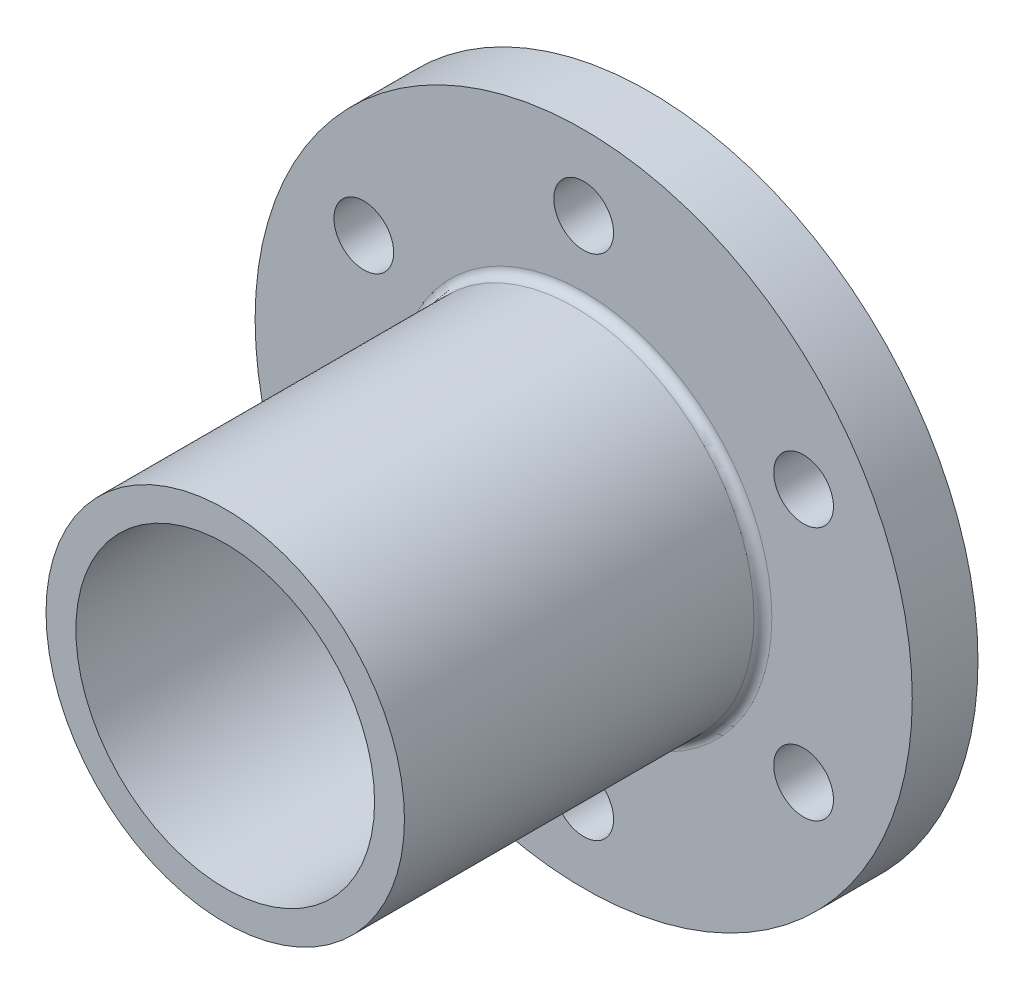
ISO-10303-21;
HEADER;
FILE_DESCRIPTION(('STEP AP214'),'2;1');
FILE_NAME('part.step','',(''),(''),'','','');
FILE_SCHEMA(('AUTOMOTIVE_DESIGN { 1 0 10303 214 1 1 1 1 }'));
ENDSEC;
DATA;
#1=APPLICATION_CONTEXT('core data for automotive mechanical design processes');
#2=APPLICATION_PROTOCOL_DEFINITION('international standard','automotive_design',2000,#1);
#3=PRODUCT_CONTEXT('',#1,'mechanical');
#4=PRODUCT('Part','Part','',(#3));
#5=PRODUCT_RELATED_PRODUCT_CATEGORY('part','',(#4));
#6=PRODUCT_DEFINITION_FORMATION('','',#4);
#7=PRODUCT_DEFINITION_CONTEXT('part definition',#1,'design');
#8=PRODUCT_DEFINITION('design','',#6,#7);
#9=PRODUCT_DEFINITION_SHAPE('','',#8);
#10=(LENGTH_UNIT() NAMED_UNIT(*) SI_UNIT(.MILLI.,.METRE.));
#11=(NAMED_UNIT(*) PLANE_ANGLE_UNIT() SI_UNIT($,.RADIAN.));
#12=(NAMED_UNIT(*) SI_UNIT($,.STERADIAN.) SOLID_ANGLE_UNIT());
#13=UNCERTAINTY_MEASURE_WITH_UNIT(LENGTH_MEASURE(1.E-05),#10,'distance_accuracy_value','');
#14=(GEOMETRIC_REPRESENTATION_CONTEXT(3) GLOBAL_UNCERTAINTY_ASSIGNED_CONTEXT((#13)) GLOBAL_UNIT_ASSIGNED_CONTEXT((#10,
#11,#12)) REPRESENTATION_CONTEXT('',''));
#15=CARTESIAN_POINT('',(0.,0.,0.));
#16=DIRECTION('',(0.,0.,1.));
#17=DIRECTION('',(1.,0.,0.));
#18=AXIS2_PLACEMENT_3D('',#15,#16,#17);
#19=CARTESIAN_POINT('',(0.,0.,22.));
#20=DIRECTION('',(0.,0.,-1.));
#21=DIRECTION('',(-1.,0.,0.));
#22=AXIS2_PLACEMENT_3D('',#19,#20,#21);
#23=CYLINDRICAL_SURFACE('',#22,110.);
#24=CARTESIAN_POINT('',(0.,0.,22.));
#25=DIRECTION('',(0.,0.,1.));
#26=DIRECTION('',(1.,0.,0.));
#27=AXIS2_PLACEMENT_3D('',#24,#25,#26);
#28=CIRCLE('',#27,110.);
#29=CARTESIAN_POINT('',(110.,0.,22.));
#30=VERTEX_POINT('',#29);
#31=EDGE_CURVE('E50',#30,#30,#28,.T.);
#32=ORIENTED_EDGE('',*,*,#31,.F.);
#33=EDGE_LOOP('',(#32));
#34=FACE_BOUND('',#33,.T.);
#35=CARTESIAN_POINT('',(0.,0.,0.));
#36=DIRECTION('',(0.,0.,1.));
#37=DIRECTION('',(1.,0.,0.));
#38=AXIS2_PLACEMENT_3D('',#35,#36,#37);
#39=CIRCLE('',#38,110.);
#40=CARTESIAN_POINT('',(110.,0.,0.));
#41=VERTEX_POINT('',#40);
#42=EDGE_CURVE('E55',#41,#41,#39,.T.);
#43=ORIENTED_EDGE('',*,*,#42,.T.);
#44=EDGE_LOOP('',(#43));
#45=FACE_BOUND('',#44,.T.);
#46=ADVANCED_FACE('F37',(#34,#45),#23,.T.);
#47=CARTESIAN_POINT('',(0.,0.,22.));
#48=DIRECTION('',(0.,0.,1.));
#49=DIRECTION('',(1.,0.,0.));
#50=AXIS2_PLACEMENT_3D('',#47,#48,#49);
#51=PLANE('',#50);
#52=CARTESIAN_POINT('',(0.,0.,22.));
#53=DIRECTION('',(0.,0.,1.));
#54=DIRECTION('',(1.,0.,0.));
#55=AXIS2_PLACEMENT_3D('',#52,#53,#54);
#56=CIRCLE('',#55,63.);
#57=CARTESIAN_POINT('',(63.,0.,22.));
#58=VERTEX_POINT('',#57);
#59=EDGE_CURVE('E10',#58,#58,#56,.F.);
#60=ORIENTED_EDGE('',*,*,#59,.T.);
#61=EDGE_LOOP('',(#60));
#62=FACE_BOUND('',#61,.T.);
#63=CARTESIAN_POINT('',(0.,85.,22.));
#64=DIRECTION('',(0.,0.,1.));
#65=DIRECTION('',(1.,0.,0.));
#66=AXIS2_PLACEMENT_3D('',#63,#64,#65);
#67=CIRCLE('',#66,10.);
#68=CARTESIAN_POINT('',(10.,85.,22.));
#69=VERTEX_POINT('',#68);
#70=EDGE_CURVE('E107',#69,#69,#67,.T.);
#71=ORIENTED_EDGE('',*,*,#70,.F.);
#72=EDGE_LOOP('',(#71));
#73=FACE_BOUND('',#72,.T.);
#74=CARTESIAN_POINT('',(-73.6121593216755,42.4999999999968,22.));
#75=DIRECTION('',(0.,0.,1.));
#76=DIRECTION('',(1.,0.,0.));
#77=AXIS2_PLACEMENT_3D('',#74,#75,#76);
#78=CIRCLE('',#77,10.0000000000036);
#79=CARTESIAN_POINT('',(-63.6121593216719,42.4999999999968,22.));
#80=VERTEX_POINT('',#79);
#81=EDGE_CURVE('E108',#80,#80,#78,.T.);
#82=ORIENTED_EDGE('',*,*,#81,.F.);
#83=EDGE_LOOP('',(#82));
#84=FACE_BOUND('',#83,.T.);
#85=CARTESIAN_POINT('',(-73.6121593216719,-42.5000000000032,22.));
#86=DIRECTION('',(0.,0.,1.));
#87=DIRECTION('',(1.,0.,0.));
#88=AXIS2_PLACEMENT_3D('',#85,#86,#87);
#89=CIRCLE('',#88,10.0000000000069);
#90=CARTESIAN_POINT('',(-63.612159321665,-42.5000000000032,22.));
#91=VERTEX_POINT('',#90);
#92=EDGE_CURVE('E74',#91,#91,#89,.T.);
#93=ORIENTED_EDGE('',*,*,#92,.F.);
#94=EDGE_LOOP('',(#93));
#95=FACE_BOUND('',#94,.T.);
#96=CARTESIAN_POINT('',(7.21630741137477E-12,-85.,22.));
#97=DIRECTION('',(0.,0.,1.));
#98=DIRECTION('',(1.,0.,0.));
#99=AXIS2_PLACEMENT_3D('',#96,#97,#98);
#100=CIRCLE('',#99,10.0000000000075);
#101=CARTESIAN_POINT('',(10.0000000000147,-85.,22.));
#102=VERTEX_POINT('',#101);
#103=EDGE_CURVE('E83',#102,#102,#100,.T.);
#104=ORIENTED_EDGE('',*,*,#103,.F.);
#105=EDGE_LOOP('',(#104));
#106=FACE_BOUND('',#105,.T.);
#107=CARTESIAN_POINT('',(73.6121593216827,-42.4999999999969,22.));
#108=DIRECTION('',(0.,0.,1.));
#109=DIRECTION('',(1.,0.,0.));
#110=AXIS2_PLACEMENT_3D('',#107,#108,#109);
#111=CIRCLE('',#110,10.0000000000046);
#112=CARTESIAN_POINT('',(83.6121593216873,-42.4999999999969,22.));
#113=VERTEX_POINT('',#112);
#114=EDGE_CURVE('E91',#113,#113,#111,.T.);
#115=ORIENTED_EDGE('',*,*,#114,.F.);
#116=EDGE_LOOP('',(#115));
#117=FACE_BOUND('',#116,.T.);
#118=CARTESIAN_POINT('',(73.6121593216791,42.5000000000031,22.));
#119=DIRECTION('',(0.,0.,1.));
#120=DIRECTION('',(1.,0.,0.));
#121=AXIS2_PLACEMENT_3D('',#118,#119,#120);
#122=CIRCLE('',#121,10.000000000001);
#123=CARTESIAN_POINT('',(83.6121593216801,42.5000000000031,22.));
#124=VERTEX_POINT('',#123);
#125=EDGE_CURVE('E99',#124,#124,#122,.T.);
#126=ORIENTED_EDGE('',*,*,#125,.F.);
#127=EDGE_LOOP('',(#126));
#128=FACE_BOUND('',#127,.T.);
#129=ORIENTED_EDGE('',*,*,#31,.T.);
#130=EDGE_LOOP('',(#129));
#131=FACE_BOUND('',#130,.T.);
#132=ADVANCED_FACE('F132',(#62,#73,#84,#95,#106,#117,#128,#131),#51,.T.);
#133=CARTESIAN_POINT('',(0.,0.,0.));
#134=DIRECTION('',(0.,0.,1.));
#135=DIRECTION('',(1.,0.,0.));
#136=AXIS2_PLACEMENT_3D('',#133,#134,#135);
#137=PLANE('',#136);
#138=CARTESIAN_POINT('',(0.,85.,0.));
#139=DIRECTION('',(0.,0.,1.));
#140=DIRECTION('',(1.,0.,0.));
#141=AXIS2_PLACEMENT_3D('',#138,#139,#140);
#142=CIRCLE('',#141,10.);
#143=CARTESIAN_POINT('',(10.,85.,0.));
#144=VERTEX_POINT('',#143);
#145=EDGE_CURVE('E73',#144,#144,#142,.T.);
#146=ORIENTED_EDGE('',*,*,#145,.T.);
#147=EDGE_LOOP('',(#146));
#148=FACE_BOUND('',#147,.T.);
#149=CARTESIAN_POINT('',(-73.6121593216755,42.4999999999968,0.));
#150=DIRECTION('',(0.,0.,1.));
#151=DIRECTION('',(1.,0.,0.));
#152=AXIS2_PLACEMENT_3D('',#149,#150,#151);
#153=CIRCLE('',#152,10.0000000000036);
#154=CARTESIAN_POINT('',(-63.6121593216719,42.4999999999968,0.));
#155=VERTEX_POINT('',#154);
#156=EDGE_CURVE('E79',#155,#155,#153,.T.);
#157=ORIENTED_EDGE('',*,*,#156,.T.);
#158=EDGE_LOOP('',(#157));
#159=FACE_BOUND('',#158,.T.);
#160=CARTESIAN_POINT('',(-73.6121593216719,-42.5000000000032,0.));
#161=DIRECTION('',(0.,0.,1.));
#162=DIRECTION('',(1.,0.,0.));
#163=AXIS2_PLACEMENT_3D('',#160,#161,#162);
#164=CIRCLE('',#163,10.0000000000069);
#165=CARTESIAN_POINT('',(-63.612159321665,-42.5000000000032,0.));
#166=VERTEX_POINT('',#165);
#167=EDGE_CURVE('E78',#166,#166,#164,.T.);
#168=ORIENTED_EDGE('',*,*,#167,.T.);
#169=EDGE_LOOP('',(#168));
#170=FACE_BOUND('',#169,.T.);
#171=CARTESIAN_POINT('',(7.21630741137477E-12,-85.,0.));
#172=DIRECTION('',(0.,0.,1.));
#173=DIRECTION('',(1.,0.,0.));
#174=AXIS2_PLACEMENT_3D('',#171,#172,#173);
#175=CIRCLE('',#174,10.0000000000075);
#176=CARTESIAN_POINT('',(10.0000000000147,-85.,0.));
#177=VERTEX_POINT('',#176);
#178=EDGE_CURVE('E87',#177,#177,#175,.T.);
#179=ORIENTED_EDGE('',*,*,#178,.T.);
#180=EDGE_LOOP('',(#179));
#181=FACE_BOUND('',#180,.T.);
#182=CARTESIAN_POINT('',(73.6121593216827,-42.4999999999969,0.));
#183=DIRECTION('',(0.,0.,1.));
#184=DIRECTION('',(1.,0.,0.));
#185=AXIS2_PLACEMENT_3D('',#182,#183,#184);
#186=CIRCLE('',#185,10.0000000000046);
#187=CARTESIAN_POINT('',(83.6121593216873,-42.4999999999969,0.));
#188=VERTEX_POINT('',#187);
#189=EDGE_CURVE('E95',#188,#188,#186,.T.);
#190=ORIENTED_EDGE('',*,*,#189,.T.);
#191=EDGE_LOOP('',(#190));
#192=FACE_BOUND('',#191,.T.);
#193=CARTESIAN_POINT('',(73.6121593216791,42.5000000000031,0.));
#194=DIRECTION('',(0.,0.,1.));
#195=DIRECTION('',(1.,0.,0.));
#196=AXIS2_PLACEMENT_3D('',#193,#194,#195);
#197=CIRCLE('',#196,10.000000000001);
#198=CARTESIAN_POINT('',(83.6121593216801,42.5000000000031,0.));
#199=VERTEX_POINT('',#198);
#200=EDGE_CURVE('E103',#199,#199,#197,.T.);
#201=ORIENTED_EDGE('',*,*,#200,.T.);
#202=EDGE_LOOP('',(#201));
#203=FACE_BOUND('',#202,.T.);
#204=CARTESIAN_POINT('',(0.,0.,0.));
#205=DIRECTION('',(0.,0.,1.));
#206=DIRECTION('',(1.,0.,0.));
#207=AXIS2_PLACEMENT_3D('',#204,#205,#206);
#208=CIRCLE('',#207,50.);
#209=CARTESIAN_POINT('',(50.,0.,0.));
#210=VERTEX_POINT('',#209);
#211=EDGE_CURVE('E65',#210,#210,#208,.T.);
#212=ORIENTED_EDGE('',*,*,#211,.T.);
#213=EDGE_LOOP('',(#212));
#214=FACE_BOUND('',#213,.T.);
#215=ORIENTED_EDGE('',*,*,#42,.F.);
#216=EDGE_LOOP('',(#215));
#217=FACE_BOUND('',#216,.T.);
#218=ADVANCED_FACE('F122',(#148,#159,#170,#181,#192,#203,#214,#217),#137,.F.);
#219=CARTESIAN_POINT('',(0.,0.,142.));
#220=DIRECTION('',(0.,0.,-1.));
#221=DIRECTION('',(-1.,0.,0.));
#222=AXIS2_PLACEMENT_3D('',#219,#220,#221);
#223=CYLINDRICAL_SURFACE('',#222,60.);
#224=CARTESIAN_POINT('',(0.,0.,25.));
#225=DIRECTION('',(0.,0.,1.));
#226=DIRECTION('',(1.,0.,0.));
#227=AXIS2_PLACEMENT_3D('',#224,#225,#226);
#228=CIRCLE('',#227,60.);
#229=CARTESIAN_POINT('',(60.,0.,25.));
#230=VERTEX_POINT('',#229);
#231=EDGE_CURVE('E45',#230,#230,#228,.T.);
#232=ORIENTED_EDGE('',*,*,#231,.T.);
#233=EDGE_LOOP('',(#232));
#234=FACE_BOUND('',#233,.T.);
#235=CARTESIAN_POINT('',(0.,0.,142.));
#236=DIRECTION('',(0.,0.,1.));
#237=DIRECTION('',(1.,0.,0.));
#238=AXIS2_PLACEMENT_3D('',#235,#236,#237);
#239=CIRCLE('',#238,60.);
#240=CARTESIAN_POINT('',(60.,0.,142.));
#241=VERTEX_POINT('',#240);
#242=EDGE_CURVE('E60',#241,#241,#239,.T.);
#243=ORIENTED_EDGE('',*,*,#242,.F.);
#244=EDGE_LOOP('',(#243));
#245=FACE_BOUND('',#244,.T.);
#246=ADVANCED_FACE('F153',(#234,#245),#223,.T.);
#247=CARTESIAN_POINT('',(0.,0.,142.));
#248=DIRECTION('',(0.,0.,1.));
#249=DIRECTION('',(1.,0.,0.));
#250=AXIS2_PLACEMENT_3D('',#247,#248,#249);
#251=PLANE('',#250);
#252=CARTESIAN_POINT('',(0.,0.,142.));
#253=DIRECTION('',(0.,0.,1.));
#254=DIRECTION('',(1.,0.,0.));
#255=AXIS2_PLACEMENT_3D('',#252,#253,#254);
#256=CIRCLE('',#255,50.);
#257=CARTESIAN_POINT('',(50.,0.,142.));
#258=VERTEX_POINT('',#257);
#259=EDGE_CURVE('E69',#258,#258,#256,.T.);
#260=ORIENTED_EDGE('',*,*,#259,.F.);
#261=EDGE_LOOP('',(#260));
#262=FACE_BOUND('',#261,.T.);
#263=ORIENTED_EDGE('',*,*,#242,.T.);
#264=EDGE_LOOP('',(#263));
#265=FACE_BOUND('',#264,.T.);
#266=ADVANCED_FACE('F158',(#262,#265),#251,.T.);
#267=CARTESIAN_POINT('',(0.,0.,-65.0000000000001));
#268=DIRECTION('',(0.,0.,1.));
#269=DIRECTION('',(1.,0.,0.));
#270=AXIS2_PLACEMENT_3D('',#267,#268,#269);
#271=CYLINDRICAL_SURFACE('',#270,50.);
#272=ORIENTED_EDGE('',*,*,#259,.T.);
#273=EDGE_LOOP('',(#272));
#274=FACE_BOUND('',#273,.T.);
#275=ORIENTED_EDGE('',*,*,#211,.F.);
#276=EDGE_LOOP('',(#275));
#277=FACE_BOUND('',#276,.T.);
#278=ADVANCED_FACE('F163',(#274,#277),#271,.F.);
#279=CARTESIAN_POINT('',(73.6121593216791,42.5000000000031,0.));
#280=DIRECTION('',(0.,0.,1.));
#281=DIRECTION('',(1.,0.,0.));
#282=AXIS2_PLACEMENT_3D('',#279,#280,#281);
#283=CYLINDRICAL_SURFACE('',#282,10.000000000001);
#284=ORIENTED_EDGE('',*,*,#200,.F.);
#285=EDGE_LOOP('',(#284));
#286=FACE_BOUND('',#285,.T.);
#287=ORIENTED_EDGE('',*,*,#125,.T.);
#288=EDGE_LOOP('',(#287));
#289=FACE_BOUND('',#288,.T.);
#290=ADVANCED_FACE('F167',(#286,#289),#283,.F.);
#291=CARTESIAN_POINT('',(73.6121593216827,-42.4999999999969,0.));
#292=DIRECTION('',(0.,0.,1.));
#293=DIRECTION('',(1.,0.,0.));
#294=AXIS2_PLACEMENT_3D('',#291,#292,#293);
#295=CYLINDRICAL_SURFACE('',#294,10.0000000000046);
#296=ORIENTED_EDGE('',*,*,#189,.F.);
#297=EDGE_LOOP('',(#296));
#298=FACE_BOUND('',#297,.T.);
#299=ORIENTED_EDGE('',*,*,#114,.T.);
#300=EDGE_LOOP('',(#299));
#301=FACE_BOUND('',#300,.T.);
#302=ADVANCED_FACE('F176',(#298,#301),#295,.F.);
#303=CARTESIAN_POINT('',(7.21630741137477E-12,-85.,0.));
#304=DIRECTION('',(0.,0.,1.));
#305=DIRECTION('',(1.,0.,0.));
#306=AXIS2_PLACEMENT_3D('',#303,#304,#305);
#307=CYLINDRICAL_SURFACE('',#306,10.0000000000075);
#308=ORIENTED_EDGE('',*,*,#178,.F.);
#309=EDGE_LOOP('',(#308));
#310=FACE_BOUND('',#309,.T.);
#311=ORIENTED_EDGE('',*,*,#103,.T.);
#312=EDGE_LOOP('',(#311));
#313=FACE_BOUND('',#312,.T.);
#314=ADVANCED_FACE('F172',(#310,#313),#307,.F.);
#315=CARTESIAN_POINT('',(-73.6121593216719,-42.5000000000032,0.));
#316=DIRECTION('',(0.,0.,1.));
#317=DIRECTION('',(1.,0.,0.));
#318=AXIS2_PLACEMENT_3D('',#315,#316,#317);
#319=CYLINDRICAL_SURFACE('',#318,10.0000000000069);
#320=ORIENTED_EDGE('',*,*,#167,.F.);
#321=EDGE_LOOP('',(#320));
#322=FACE_BOUND('',#321,.T.);
#323=ORIENTED_EDGE('',*,*,#92,.T.);
#324=EDGE_LOOP('',(#323));
#325=FACE_BOUND('',#324,.T.);
#326=ADVANCED_FACE('F169',(#322,#325),#319,.F.);
#327=CARTESIAN_POINT('',(-73.6121593216755,42.4999999999968,0.));
#328=DIRECTION('',(0.,0.,1.));
#329=DIRECTION('',(1.,0.,0.));
#330=AXIS2_PLACEMENT_3D('',#327,#328,#329);
#331=CYLINDRICAL_SURFACE('',#330,10.0000000000036);
#332=ORIENTED_EDGE('',*,*,#156,.F.);
#333=EDGE_LOOP('',(#332));
#334=FACE_BOUND('',#333,.T.);
#335=ORIENTED_EDGE('',*,*,#81,.T.);
#336=EDGE_LOOP('',(#335));
#337=FACE_BOUND('',#336,.T.);
#338=ADVANCED_FACE('F128',(#334,#337),#331,.F.);
#339=CARTESIAN_POINT('',(0.,85.,0.));
#340=DIRECTION('',(0.,0.,1.));
#341=DIRECTION('',(1.,0.,0.));
#342=AXIS2_PLACEMENT_3D('',#339,#340,#341);
#343=CYLINDRICAL_SURFACE('',#342,10.);
#344=ORIENTED_EDGE('',*,*,#145,.F.);
#345=EDGE_LOOP('',(#344));
#346=FACE_BOUND('',#345,.T.);
#347=ORIENTED_EDGE('',*,*,#70,.T.);
#348=EDGE_LOOP('',(#347));
#349=FACE_BOUND('',#348,.T.);
#350=ADVANCED_FACE('F125',(#346,#349),#343,.F.);
#351=CARTESIAN_POINT('',(0.,0.,25.));
#352=DIRECTION('',(0.,0.,1.));
#353=DIRECTION('',(1.,0.,0.));
#354=AXIS2_PLACEMENT_3D('',#351,#352,#353);
#355=TOROIDAL_SURFACE('',#354,63.,3.);
#356=ORIENTED_EDGE('',*,*,#59,.F.);
#357=EDGE_LOOP('',(#356));
#358=FACE_BOUND('',#357,.T.);
#359=ORIENTED_EDGE('',*,*,#231,.F.);
#360=EDGE_LOOP('',(#359));
#361=FACE_BOUND('',#360,.T.);
#362=ADVANCED_FACE('F39',(#358,#361),#355,.F.);
#363=CLOSED_SHELL('',(#46,#132,#218,#246,#266,#278,#290,#302,#314,#326,#338,#350,#362));
#364=MANIFOLD_SOLID_BREP('B2',#363);
#365=ADVANCED_BREP_SHAPE_REPRESENTATION('',(#18,#364),#14);
#366=SHAPE_DEFINITION_REPRESENTATION(#9,#365);
ENDSEC;
END-ISO-10303-21;
